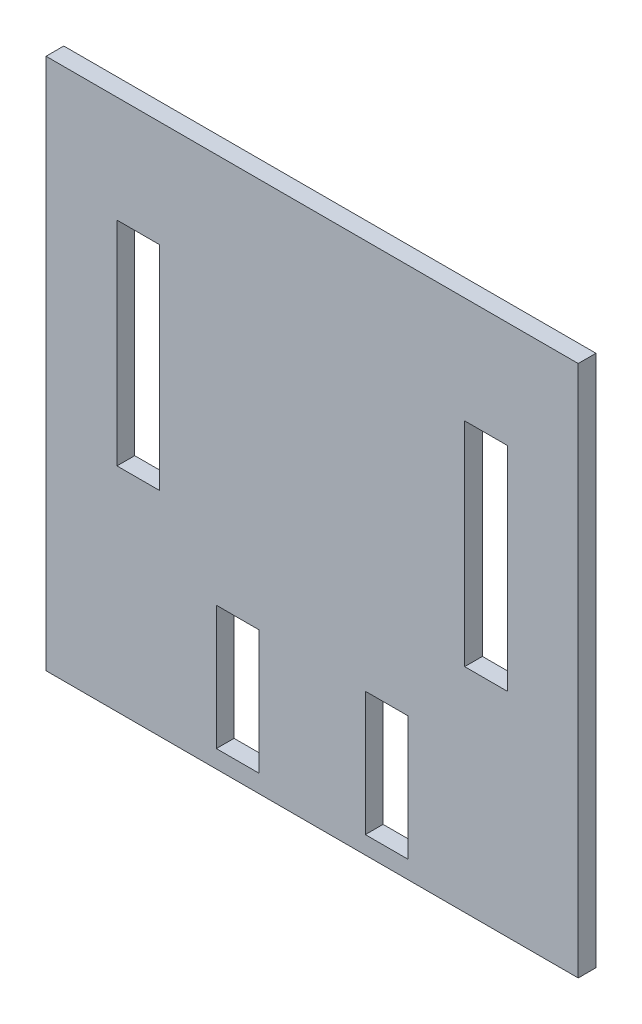
ISO-10303-21;
HEADER;
FILE_DESCRIPTION(('STEP AP214'),'2;1');
FILE_NAME('part.step','',(''),(''),'','','');
FILE_SCHEMA(('AUTOMOTIVE_DESIGN { 1 0 10303 214 1 1 1 1 }'));
ENDSEC;
DATA;
#1=APPLICATION_CONTEXT('core data for automotive mechanical design processes');
#2=APPLICATION_PROTOCOL_DEFINITION('international standard','automotive_design',2000,#1);
#3=PRODUCT_CONTEXT('',#1,'mechanical');
#4=PRODUCT('Part','Part','',(#3));
#5=PRODUCT_RELATED_PRODUCT_CATEGORY('part','',(#4));
#6=PRODUCT_DEFINITION_FORMATION('','',#4);
#7=PRODUCT_DEFINITION_CONTEXT('part definition',#1,'design');
#8=PRODUCT_DEFINITION('design','',#6,#7);
#9=PRODUCT_DEFINITION_SHAPE('','',#8);
#10=(LENGTH_UNIT() NAMED_UNIT(*) SI_UNIT(.MILLI.,.METRE.));
#11=(NAMED_UNIT(*) PLANE_ANGLE_UNIT() SI_UNIT($,.RADIAN.));
#12=(NAMED_UNIT(*) SI_UNIT($,.STERADIAN.) SOLID_ANGLE_UNIT());
#13=UNCERTAINTY_MEASURE_WITH_UNIT(LENGTH_MEASURE(1.E-05),#10,'distance_accuracy_value','');
#14=(GEOMETRIC_REPRESENTATION_CONTEXT(3) GLOBAL_UNCERTAINTY_ASSIGNED_CONTEXT((#13)) GLOBAL_UNIT_ASSIGNED_CONTEXT((#10,
#11,#12)) REPRESENTATION_CONTEXT('',''));
#15=CARTESIAN_POINT('',(0.,0.,0.));
#16=DIRECTION('',(0.,0.,1.));
#17=DIRECTION('',(1.,0.,0.));
#18=AXIS2_PLACEMENT_3D('',#15,#16,#17);
#19=CARTESIAN_POINT('',(0.,0.,5.));
#20=DIRECTION('',(1.,0.,0.));
#21=DIRECTION('',(0.,0.,-1.));
#22=AXIS2_PLACEMENT_3D('',#19,#20,#21);
#23=PLANE('',#22);
#24=DIRECTION('',(0.,-1.,0.));
#25=VECTOR('',#24,1.);
#26=CARTESIAN_POINT('',(0.,0.,0.));
#27=LINE('',#26,#25);
#28=CARTESIAN_POINT('',(0.,150.,0.));
#29=VERTEX_POINT('',#28);
#30=CARTESIAN_POINT('',(0.,0.,0.));
#31=VERTEX_POINT('',#30);
#32=EDGE_CURVE('E206',#29,#31,#27,.T.);
#33=ORIENTED_EDGE('',*,*,#32,.T.);
#34=DIRECTION('',(0.,0.,-1.));
#35=VECTOR('',#34,1.);
#36=CARTESIAN_POINT('',(0.,0.,5.));
#37=LINE('',#36,#35);
#38=CARTESIAN_POINT('',(0.,0.,5.));
#39=VERTEX_POINT('',#38);
#40=EDGE_CURVE('E11',#39,#31,#37,.T.);
#41=ORIENTED_EDGE('',*,*,#40,.F.);
#42=DIRECTION('',(0.,-1.,0.));
#43=VECTOR('',#42,1.);
#44=CARTESIAN_POINT('',(0.,0.,5.));
#45=LINE('',#44,#43);
#46=CARTESIAN_POINT('',(0.,150.,5.));
#47=VERTEX_POINT('',#46);
#48=EDGE_CURVE('E303',#47,#39,#45,.T.);
#49=ORIENTED_EDGE('',*,*,#48,.F.);
#50=DIRECTION('',(0.,0.,-1.));
#51=VECTOR('',#50,1.);
#52=CARTESIAN_POINT('',(0.,150.,5.));
#53=LINE('',#52,#51);
#54=EDGE_CURVE('E313',#47,#29,#53,.T.);
#55=ORIENTED_EDGE('',*,*,#54,.T.);
#56=EDGE_LOOP('',(#33,#41,#49,#55));
#57=FACE_BOUND('',#56,.T.);
#58=ADVANCED_FACE('F33',(#57),#23,.F.);
#59=CARTESIAN_POINT('',(0.,0.,5.));
#60=DIRECTION('',(0.,1.,0.));
#61=DIRECTION('',(0.,0.,1.));
#62=AXIS2_PLACEMENT_3D('',#59,#60,#61);
#63=PLANE('',#62);
#64=DIRECTION('',(1.,0.,0.));
#65=VECTOR('',#64,1.);
#66=CARTESIAN_POINT('',(0.,0.,0.));
#67=LINE('',#66,#65);
#68=CARTESIAN_POINT('',(150.,0.,0.));
#69=VERTEX_POINT('',#68);
#70=EDGE_CURVE('E316',#31,#69,#67,.T.);
#71=ORIENTED_EDGE('',*,*,#70,.T.);
#72=DIRECTION('',(0.,0.,-1.));
#73=VECTOR('',#72,1.);
#74=CARTESIAN_POINT('',(150.,0.,5.));
#75=LINE('',#74,#73);
#76=CARTESIAN_POINT('',(150.,0.,5.));
#77=VERTEX_POINT('',#76);
#78=EDGE_CURVE('E40',#77,#69,#75,.T.);
#79=ORIENTED_EDGE('',*,*,#78,.F.);
#80=DIRECTION('',(1.,0.,0.));
#81=VECTOR('',#80,1.);
#82=CARTESIAN_POINT('',(0.,0.,5.));
#83=LINE('',#82,#81);
#84=EDGE_CURVE('E306',#39,#77,#83,.T.);
#85=ORIENTED_EDGE('',*,*,#84,.F.);
#86=ORIENTED_EDGE('',*,*,#40,.T.);
#87=EDGE_LOOP('',(#71,#79,#85,#86));
#88=FACE_BOUND('',#87,.T.);
#89=ADVANCED_FACE('F345',(#88),#63,.F.);
#90=CARTESIAN_POINT('',(150.,0.,5.));
#91=DIRECTION('',(-1.,0.,0.));
#92=DIRECTION('',(0.,0.,1.));
#93=AXIS2_PLACEMENT_3D('',#90,#91,#92);
#94=PLANE('',#93);
#95=DIRECTION('',(0.,1.,0.));
#96=VECTOR('',#95,1.);
#97=CARTESIAN_POINT('',(150.,0.,0.));
#98=LINE('',#97,#96);
#99=CARTESIAN_POINT('',(150.,150.,0.));
#100=VERTEX_POINT('',#99);
#101=EDGE_CURVE('E318',#69,#100,#98,.T.);
#102=ORIENTED_EDGE('',*,*,#101,.T.);
#103=DIRECTION('',(0.,0.,-1.));
#104=VECTOR('',#103,1.);
#105=CARTESIAN_POINT('',(150.,150.,5.));
#106=LINE('',#105,#104);
#107=CARTESIAN_POINT('',(150.,150.,5.));
#108=VERTEX_POINT('',#107);
#109=EDGE_CURVE('E323',#108,#100,#106,.T.);
#110=ORIENTED_EDGE('',*,*,#109,.F.);
#111=DIRECTION('',(0.,1.,0.));
#112=VECTOR('',#111,1.);
#113=CARTESIAN_POINT('',(150.,0.,5.));
#114=LINE('',#113,#112);
#115=EDGE_CURVE('E309',#77,#108,#114,.T.);
#116=ORIENTED_EDGE('',*,*,#115,.F.);
#117=ORIENTED_EDGE('',*,*,#78,.T.);
#118=EDGE_LOOP('',(#102,#110,#116,#117));
#119=FACE_BOUND('',#118,.T.);
#120=ADVANCED_FACE('F330',(#119),#94,.F.);
#121=CARTESIAN_POINT('',(0.,150.,5.));
#122=DIRECTION('',(0.,-1.,0.));
#123=DIRECTION('',(0.,0.,-1.));
#124=AXIS2_PLACEMENT_3D('',#121,#122,#123);
#125=PLANE('',#124);
#126=DIRECTION('',(-1.,0.,0.));
#127=VECTOR('',#126,1.);
#128=CARTESIAN_POINT('',(0.,150.,0.));
#129=LINE('',#128,#127);
#130=EDGE_CURVE('E307',#100,#29,#129,.T.);
#131=ORIENTED_EDGE('',*,*,#130,.T.);
#132=ORIENTED_EDGE('',*,*,#54,.F.);
#133=DIRECTION('',(-1.,0.,0.));
#134=VECTOR('',#133,1.);
#135=CARTESIAN_POINT('',(0.,150.,5.));
#136=LINE('',#135,#134);
#137=EDGE_CURVE('E311',#108,#47,#136,.T.);
#138=ORIENTED_EDGE('',*,*,#137,.F.);
#139=ORIENTED_EDGE('',*,*,#109,.T.);
#140=EDGE_LOOP('',(#131,#132,#138,#139));
#141=FACE_BOUND('',#140,.T.);
#142=ADVANCED_FACE('F338',(#141),#125,.F.);
#143=CARTESIAN_POINT('',(0.,0.,5.));
#144=DIRECTION('',(0.,0.,-1.));
#145=DIRECTION('',(-1.,0.,0.));
#146=AXIS2_PLACEMENT_3D('',#143,#144,#145);
#147=PLANE('',#146);
#148=DIRECTION('',(1.,0.,0.));
#149=VECTOR('',#148,1.);
#150=CARTESIAN_POINT('',(20.,60.,5.));
#151=LINE('',#150,#149);
#152=CARTESIAN_POINT('',(20.,60.,5.));
#153=VERTEX_POINT('',#152);
#154=CARTESIAN_POINT('',(32.,60.,5.));
#155=VERTEX_POINT('',#154);
#156=EDGE_CURVE('E199',#153,#155,#151,.T.);
#157=ORIENTED_EDGE('',*,*,#156,.F.);
#158=DIRECTION('',(0.,-1.,0.));
#159=VECTOR('',#158,1.);
#160=CARTESIAN_POINT('',(20.,120.,5.));
#161=LINE('',#160,#159);
#162=CARTESIAN_POINT('',(20.,120.,5.));
#163=VERTEX_POINT('',#162);
#164=EDGE_CURVE('E47',#163,#153,#161,.T.);
#165=ORIENTED_EDGE('',*,*,#164,.F.);
#166=DIRECTION('',(-1.,0.,0.));
#167=VECTOR('',#166,1.);
#168=CARTESIAN_POINT('',(20.,120.,5.));
#169=LINE('',#168,#167);
#170=CARTESIAN_POINT('',(32.,120.,5.));
#171=VERTEX_POINT('',#170);
#172=EDGE_CURVE('E190',#171,#163,#169,.T.);
#173=ORIENTED_EDGE('',*,*,#172,.F.);
#174=DIRECTION('',(0.,1.,0.));
#175=VECTOR('',#174,1.);
#176=CARTESIAN_POINT('',(32.,120.,5.));
#177=LINE('',#176,#175);
#178=EDGE_CURVE('E193',#155,#171,#177,.T.);
#179=ORIENTED_EDGE('',*,*,#178,.F.);
#180=EDGE_LOOP('',(#157,#165,#173,#179));
#181=FACE_BOUND('',#180,.T.);
#182=DIRECTION('',(1.,0.,0.));
#183=VECTOR('',#182,1.);
#184=CARTESIAN_POINT('',(90.,5.,5.));
#185=LINE('',#184,#183);
#186=CARTESIAN_POINT('',(90.,5.,5.));
#187=VERTEX_POINT('',#186);
#188=CARTESIAN_POINT('',(102.,5.,5.));
#189=VERTEX_POINT('',#188);
#190=EDGE_CURVE('E225',#187,#189,#185,.T.);
#191=ORIENTED_EDGE('',*,*,#190,.F.);
#192=DIRECTION('',(0.,-1.,0.));
#193=VECTOR('',#192,1.);
#194=CARTESIAN_POINT('',(90.,40.,5.));
#195=LINE('',#194,#193);
#196=CARTESIAN_POINT('',(90.,40.,5.));
#197=VERTEX_POINT('',#196);
#198=EDGE_CURVE('E55',#197,#187,#195,.T.);
#199=ORIENTED_EDGE('',*,*,#198,.F.);
#200=DIRECTION('',(-1.,0.,0.));
#201=VECTOR('',#200,1.);
#202=CARTESIAN_POINT('',(90.,40.,5.));
#203=LINE('',#202,#201);
#204=CARTESIAN_POINT('',(102.,40.,5.));
#205=VERTEX_POINT('',#204);
#206=EDGE_CURVE('E214',#205,#197,#203,.T.);
#207=ORIENTED_EDGE('',*,*,#206,.F.);
#208=DIRECTION('',(0.,1.,0.));
#209=VECTOR('',#208,1.);
#210=CARTESIAN_POINT('',(102.,40.,5.));
#211=LINE('',#210,#209);
#212=EDGE_CURVE('E228',#189,#205,#211,.T.);
#213=ORIENTED_EDGE('',*,*,#212,.F.);
#214=EDGE_LOOP('',(#191,#199,#207,#213));
#215=FACE_BOUND('',#214,.T.);
#216=DIRECTION('',(1.,0.,0.));
#217=VECTOR('',#216,1.);
#218=CARTESIAN_POINT('',(48.,5.,5.));
#219=LINE('',#218,#217);
#220=CARTESIAN_POINT('',(48.,5.,5.));
#221=VERTEX_POINT('',#220);
#222=CARTESIAN_POINT('',(60.,5.,5.));
#223=VERTEX_POINT('',#222);
#224=EDGE_CURVE('E288',#221,#223,#219,.T.);
#225=ORIENTED_EDGE('',*,*,#224,.F.);
#226=DIRECTION('',(0.,-1.,0.));
#227=VECTOR('',#226,1.);
#228=CARTESIAN_POINT('',(48.,40.,5.));
#229=LINE('',#228,#227);
#230=CARTESIAN_POINT('',(48.,40.,5.));
#231=VERTEX_POINT('',#230);
#232=EDGE_CURVE('E235',#231,#221,#229,.T.);
#233=ORIENTED_EDGE('',*,*,#232,.F.);
#234=DIRECTION('',(-1.,0.,0.));
#235=VECTOR('',#234,1.);
#236=CARTESIAN_POINT('',(48.,40.,5.));
#237=LINE('',#236,#235);
#238=CARTESIAN_POINT('',(60.,40.,5.));
#239=VERTEX_POINT('',#238);
#240=EDGE_CURVE('E277',#239,#231,#237,.T.);
#241=ORIENTED_EDGE('',*,*,#240,.F.);
#242=DIRECTION('',(0.,1.,0.));
#243=VECTOR('',#242,1.);
#244=CARTESIAN_POINT('',(60.,40.,5.));
#245=LINE('',#244,#243);
#246=EDGE_CURVE('E291',#223,#239,#245,.T.);
#247=ORIENTED_EDGE('',*,*,#246,.F.);
#248=EDGE_LOOP('',(#225,#233,#241,#247));
#249=FACE_BOUND('',#248,.T.);
#250=DIRECTION('',(1.,0.,0.));
#251=VECTOR('',#250,1.);
#252=CARTESIAN_POINT('',(118.,60.,5.));
#253=LINE('',#252,#251);
#254=CARTESIAN_POINT('',(118.,60.,5.));
#255=VERTEX_POINT('',#254);
#256=CARTESIAN_POINT('',(130.,60.,5.));
#257=VERTEX_POINT('',#256);
#258=EDGE_CURVE('E257',#255,#257,#253,.T.);
#259=ORIENTED_EDGE('',*,*,#258,.F.);
#260=DIRECTION('',(0.,-1.,0.));
#261=VECTOR('',#260,1.);
#262=CARTESIAN_POINT('',(118.,120.,5.));
#263=LINE('',#262,#261);
#264=CARTESIAN_POINT('',(118.,120.,5.));
#265=VERTEX_POINT('',#264);
#266=EDGE_CURVE('E255',#265,#255,#263,.T.);
#267=ORIENTED_EDGE('',*,*,#266,.F.);
#268=DIRECTION('',(-1.,0.,0.));
#269=VECTOR('',#268,1.);
#270=CARTESIAN_POINT('',(118.,120.,5.));
#271=LINE('',#270,#269);
#272=CARTESIAN_POINT('',(130.,120.,5.));
#273=VERTEX_POINT('',#272);
#274=EDGE_CURVE('E245',#273,#265,#271,.T.);
#275=ORIENTED_EDGE('',*,*,#274,.F.);
#276=DIRECTION('',(0.,1.,0.));
#277=VECTOR('',#276,1.);
#278=CARTESIAN_POINT('',(130.,120.,5.));
#279=LINE('',#278,#277);
#280=EDGE_CURVE('E261',#257,#273,#279,.T.);
#281=ORIENTED_EDGE('',*,*,#280,.F.);
#282=EDGE_LOOP('',(#259,#267,#275,#281));
#283=FACE_BOUND('',#282,.T.);
#284=ORIENTED_EDGE('',*,*,#48,.T.);
#285=ORIENTED_EDGE('',*,*,#84,.T.);
#286=ORIENTED_EDGE('',*,*,#115,.T.);
#287=ORIENTED_EDGE('',*,*,#137,.T.);
#288=EDGE_LOOP('',(#284,#285,#286,#287));
#289=FACE_BOUND('',#288,.T.);
#290=ADVANCED_FACE('F344',(#181,#215,#249,#283,#289),#147,.F.);
#291=CARTESIAN_POINT('',(0.,0.,0.));
#292=DIRECTION('',(0.,0.,-1.));
#293=DIRECTION('',(-1.,0.,0.));
#294=AXIS2_PLACEMENT_3D('',#291,#292,#293);
#295=PLANE('',#294);
#296=DIRECTION('',(0.,-1.,0.));
#297=VECTOR('',#296,1.);
#298=CARTESIAN_POINT('',(20.,120.,0.));
#299=LINE('',#298,#297);
#300=CARTESIAN_POINT('',(20.,120.,0.));
#301=VERTEX_POINT('',#300);
#302=CARTESIAN_POINT('',(20.,60.,0.));
#303=VERTEX_POINT('',#302);
#304=EDGE_CURVE('E171',#301,#303,#299,.T.);
#305=ORIENTED_EDGE('',*,*,#304,.T.);
#306=DIRECTION('',(1.,0.,0.));
#307=VECTOR('',#306,1.);
#308=CARTESIAN_POINT('',(20.,60.,0.));
#309=LINE('',#308,#307);
#310=CARTESIAN_POINT('',(32.,60.,0.));
#311=VERTEX_POINT('',#310);
#312=EDGE_CURVE('E181',#303,#311,#309,.T.);
#313=ORIENTED_EDGE('',*,*,#312,.T.);
#314=DIRECTION('',(0.,1.,0.));
#315=VECTOR('',#314,1.);
#316=CARTESIAN_POINT('',(32.,120.,0.));
#317=LINE('',#316,#315);
#318=CARTESIAN_POINT('',(32.,120.,0.));
#319=VERTEX_POINT('',#318);
#320=EDGE_CURVE('E185',#311,#319,#317,.T.);
#321=ORIENTED_EDGE('',*,*,#320,.T.);
#322=DIRECTION('',(-1.,0.,0.));
#323=VECTOR('',#322,1.);
#324=CARTESIAN_POINT('',(20.,120.,0.));
#325=LINE('',#324,#323);
#326=EDGE_CURVE('E177',#319,#301,#325,.T.);
#327=ORIENTED_EDGE('',*,*,#326,.T.);
#328=EDGE_LOOP('',(#305,#313,#321,#327));
#329=FACE_BOUND('',#328,.T.);
#330=DIRECTION('',(0.,-1.,0.));
#331=VECTOR('',#330,1.);
#332=CARTESIAN_POINT('',(90.,40.,0.));
#333=LINE('',#332,#331);
#334=CARTESIAN_POINT('',(90.,40.,0.));
#335=VERTEX_POINT('',#334);
#336=CARTESIAN_POINT('',(90.,5.,0.));
#337=VERTEX_POINT('',#336);
#338=EDGE_CURVE('E210',#335,#337,#333,.T.);
#339=ORIENTED_EDGE('',*,*,#338,.T.);
#340=DIRECTION('',(1.,0.,0.));
#341=VECTOR('',#340,1.);
#342=CARTESIAN_POINT('',(90.,5.,0.));
#343=LINE('',#342,#341);
#344=CARTESIAN_POINT('',(102.,5.,0.));
#345=VERTEX_POINT('',#344);
#346=EDGE_CURVE('E213',#337,#345,#343,.T.);
#347=ORIENTED_EDGE('',*,*,#346,.T.);
#348=DIRECTION('',(0.,1.,0.));
#349=VECTOR('',#348,1.);
#350=CARTESIAN_POINT('',(102.,40.,0.));
#351=LINE('',#350,#349);
#352=CARTESIAN_POINT('',(102.,40.,0.));
#353=VERTEX_POINT('',#352);
#354=EDGE_CURVE('E217',#345,#353,#351,.T.);
#355=ORIENTED_EDGE('',*,*,#354,.T.);
#356=DIRECTION('',(-1.,0.,0.));
#357=VECTOR('',#356,1.);
#358=CARTESIAN_POINT('',(90.,40.,0.));
#359=LINE('',#358,#357);
#360=EDGE_CURVE('E220',#353,#335,#359,.T.);
#361=ORIENTED_EDGE('',*,*,#360,.T.);
#362=EDGE_LOOP('',(#339,#347,#355,#361));
#363=FACE_BOUND('',#362,.T.);
#364=DIRECTION('',(0.,-1.,0.));
#365=VECTOR('',#364,1.);
#366=CARTESIAN_POINT('',(48.,40.,0.));
#367=LINE('',#366,#365);
#368=CARTESIAN_POINT('',(48.,40.,0.));
#369=VERTEX_POINT('',#368);
#370=CARTESIAN_POINT('',(48.,5.,0.));
#371=VERTEX_POINT('',#370);
#372=EDGE_CURVE('E273',#369,#371,#367,.T.);
#373=ORIENTED_EDGE('',*,*,#372,.T.);
#374=DIRECTION('',(1.,0.,0.));
#375=VECTOR('',#374,1.);
#376=CARTESIAN_POINT('',(48.,5.,0.));
#377=LINE('',#376,#375);
#378=CARTESIAN_POINT('',(60.,5.,0.));
#379=VERTEX_POINT('',#378);
#380=EDGE_CURVE('E276',#371,#379,#377,.T.);
#381=ORIENTED_EDGE('',*,*,#380,.T.);
#382=DIRECTION('',(0.,1.,0.));
#383=VECTOR('',#382,1.);
#384=CARTESIAN_POINT('',(60.,40.,0.));
#385=LINE('',#384,#383);
#386=CARTESIAN_POINT('',(60.,40.,0.));
#387=VERTEX_POINT('',#386);
#388=EDGE_CURVE('E280',#379,#387,#385,.T.);
#389=ORIENTED_EDGE('',*,*,#388,.T.);
#390=DIRECTION('',(-1.,0.,0.));
#391=VECTOR('',#390,1.);
#392=CARTESIAN_POINT('',(48.,40.,0.));
#393=LINE('',#392,#391);
#394=EDGE_CURVE('E283',#387,#369,#393,.T.);
#395=ORIENTED_EDGE('',*,*,#394,.T.);
#396=EDGE_LOOP('',(#373,#381,#389,#395));
#397=FACE_BOUND('',#396,.T.);
#398=DIRECTION('',(0.,-1.,0.));
#399=VECTOR('',#398,1.);
#400=CARTESIAN_POINT('',(118.,120.,0.));
#401=LINE('',#400,#399);
#402=CARTESIAN_POINT('',(118.,120.,0.));
#403=VERTEX_POINT('',#402);
#404=CARTESIAN_POINT('',(118.,60.,0.));
#405=VERTEX_POINT('',#404);
#406=EDGE_CURVE('E241',#403,#405,#401,.T.);
#407=ORIENTED_EDGE('',*,*,#406,.T.);
#408=DIRECTION('',(1.,0.,0.));
#409=VECTOR('',#408,1.);
#410=CARTESIAN_POINT('',(118.,60.,0.));
#411=LINE('',#410,#409);
#412=CARTESIAN_POINT('',(130.,60.,0.));
#413=VERTEX_POINT('',#412);
#414=EDGE_CURVE('E244',#405,#413,#411,.T.);
#415=ORIENTED_EDGE('',*,*,#414,.T.);
#416=DIRECTION('',(0.,1.,0.));
#417=VECTOR('',#416,1.);
#418=CARTESIAN_POINT('',(130.,120.,0.));
#419=LINE('',#418,#417);
#420=CARTESIAN_POINT('',(130.,120.,0.));
#421=VERTEX_POINT('',#420);
#422=EDGE_CURVE('E248',#413,#421,#419,.T.);
#423=ORIENTED_EDGE('',*,*,#422,.T.);
#424=DIRECTION('',(-1.,0.,0.));
#425=VECTOR('',#424,1.);
#426=CARTESIAN_POINT('',(118.,120.,0.));
#427=LINE('',#426,#425);
#428=EDGE_CURVE('E251',#421,#403,#427,.T.);
#429=ORIENTED_EDGE('',*,*,#428,.T.);
#430=EDGE_LOOP('',(#407,#415,#423,#429));
#431=FACE_BOUND('',#430,.T.);
#432=ORIENTED_EDGE('',*,*,#32,.F.);
#433=ORIENTED_EDGE('',*,*,#130,.F.);
#434=ORIENTED_EDGE('',*,*,#101,.F.);
#435=ORIENTED_EDGE('',*,*,#70,.F.);
#436=EDGE_LOOP('',(#432,#433,#434,#435));
#437=FACE_BOUND('',#436,.T.);
#438=ADVANCED_FACE('F187',(#329,#363,#397,#431,#437),#295,.T.);
#439=CARTESIAN_POINT('',(118.,120.,0.));
#440=DIRECTION('',(-1.,0.,0.));
#441=DIRECTION('',(0.,-1.,0.));
#442=AXIS2_PLACEMENT_3D('',#439,#440,#441);
#443=PLANE('',#442);
#444=ORIENTED_EDGE('',*,*,#266,.T.);
#445=DIRECTION('',(0.,0.,1.));
#446=VECTOR('',#445,1.);
#447=CARTESIAN_POINT('',(118.,60.,0.));
#448=LINE('',#447,#446);
#449=EDGE_CURVE('E254',#405,#255,#448,.T.);
#450=ORIENTED_EDGE('',*,*,#449,.F.);
#451=ORIENTED_EDGE('',*,*,#406,.F.);
#452=DIRECTION('',(0.,0.,1.));
#453=VECTOR('',#452,1.);
#454=CARTESIAN_POINT('',(118.,120.,0.));
#455=LINE('',#454,#453);
#456=EDGE_CURVE('E200',#403,#265,#455,.T.);
#457=ORIENTED_EDGE('',*,*,#456,.T.);
#458=EDGE_LOOP('',(#444,#450,#451,#457));
#459=FACE_BOUND('',#458,.T.);
#460=ADVANCED_FACE('F357',(#459),#443,.F.);
#461=CARTESIAN_POINT('',(118.,120.,0.));
#462=DIRECTION('',(0.,1.,0.));
#463=DIRECTION('',(-1.,0.,0.));
#464=AXIS2_PLACEMENT_3D('',#461,#462,#463);
#465=PLANE('',#464);
#466=ORIENTED_EDGE('',*,*,#274,.T.);
#467=ORIENTED_EDGE('',*,*,#456,.F.);
#468=ORIENTED_EDGE('',*,*,#428,.F.);
#469=DIRECTION('',(0.,0.,1.));
#470=VECTOR('',#469,1.);
#471=CARTESIAN_POINT('',(130.,120.,0.));
#472=LINE('',#471,#470);
#473=EDGE_CURVE('E267',#421,#273,#472,.T.);
#474=ORIENTED_EDGE('',*,*,#473,.T.);
#475=EDGE_LOOP('',(#466,#467,#468,#474));
#476=FACE_BOUND('',#475,.T.);
#477=ADVANCED_FACE('F381',(#476),#465,.F.);
#478=CARTESIAN_POINT('',(130.,120.,0.));
#479=DIRECTION('',(1.,0.,0.));
#480=DIRECTION('',(0.,1.,0.));
#481=AXIS2_PLACEMENT_3D('',#478,#479,#480);
#482=PLANE('',#481);
#483=ORIENTED_EDGE('',*,*,#280,.T.);
#484=ORIENTED_EDGE('',*,*,#473,.F.);
#485=ORIENTED_EDGE('',*,*,#422,.F.);
#486=DIRECTION('',(0.,0.,1.));
#487=VECTOR('',#486,1.);
#488=CARTESIAN_POINT('',(130.,60.,0.));
#489=LINE('',#488,#487);
#490=EDGE_CURVE('E269',#413,#257,#489,.T.);
#491=ORIENTED_EDGE('',*,*,#490,.T.);
#492=EDGE_LOOP('',(#483,#484,#485,#491));
#493=FACE_BOUND('',#492,.T.);
#494=ADVANCED_FACE('F385',(#493),#482,.F.);
#495=CARTESIAN_POINT('',(118.,60.,0.));
#496=DIRECTION('',(0.,-1.,0.));
#497=DIRECTION('',(0.,0.,-1.));
#498=AXIS2_PLACEMENT_3D('',#495,#496,#497);
#499=PLANE('',#498);
#500=ORIENTED_EDGE('',*,*,#258,.T.);
#501=ORIENTED_EDGE('',*,*,#490,.F.);
#502=ORIENTED_EDGE('',*,*,#414,.F.);
#503=ORIENTED_EDGE('',*,*,#449,.T.);
#504=EDGE_LOOP('',(#500,#501,#502,#503));
#505=FACE_BOUND('',#504,.T.);
#506=ADVANCED_FACE('F365',(#505),#499,.F.);
#507=CARTESIAN_POINT('',(48.,40.,0.));
#508=DIRECTION('',(-1.,0.,0.));
#509=DIRECTION('',(0.,-1.,0.));
#510=AXIS2_PLACEMENT_3D('',#507,#508,#509);
#511=PLANE('',#510);
#512=ORIENTED_EDGE('',*,*,#232,.T.);
#513=DIRECTION('',(0.,0.,1.));
#514=VECTOR('',#513,1.);
#515=CARTESIAN_POINT('',(48.,5.,0.));
#516=LINE('',#515,#514);
#517=EDGE_CURVE('E286',#371,#221,#516,.T.);
#518=ORIENTED_EDGE('',*,*,#517,.F.);
#519=ORIENTED_EDGE('',*,*,#372,.F.);
#520=DIRECTION('',(0.,0.,1.));
#521=VECTOR('',#520,1.);
#522=CARTESIAN_POINT('',(48.,40.,0.));
#523=LINE('',#522,#521);
#524=EDGE_CURVE('E258',#369,#231,#523,.T.);
#525=ORIENTED_EDGE('',*,*,#524,.T.);
#526=EDGE_LOOP('',(#512,#518,#519,#525));
#527=FACE_BOUND('',#526,.T.);
#528=ADVANCED_FACE('F361',(#527),#511,.F.);
#529=CARTESIAN_POINT('',(48.,40.,0.));
#530=DIRECTION('',(0.,1.,0.));
#531=DIRECTION('',(0.,0.,1.));
#532=AXIS2_PLACEMENT_3D('',#529,#530,#531);
#533=PLANE('',#532);
#534=ORIENTED_EDGE('',*,*,#240,.T.);
#535=ORIENTED_EDGE('',*,*,#524,.F.);
#536=ORIENTED_EDGE('',*,*,#394,.F.);
#537=DIRECTION('',(0.,0.,1.));
#538=VECTOR('',#537,1.);
#539=CARTESIAN_POINT('',(60.,40.,0.));
#540=LINE('',#539,#538);
#541=EDGE_CURVE('E297',#387,#239,#540,.T.);
#542=ORIENTED_EDGE('',*,*,#541,.T.);
#543=EDGE_LOOP('',(#534,#535,#536,#542));
#544=FACE_BOUND('',#543,.T.);
#545=ADVANCED_FACE('F364',(#544),#533,.F.);
#546=CARTESIAN_POINT('',(60.,40.,0.));
#547=DIRECTION('',(1.,0.,0.));
#548=DIRECTION('',(0.,1.,0.));
#549=AXIS2_PLACEMENT_3D('',#546,#547,#548);
#550=PLANE('',#549);
#551=ORIENTED_EDGE('',*,*,#246,.T.);
#552=ORIENTED_EDGE('',*,*,#541,.F.);
#553=ORIENTED_EDGE('',*,*,#388,.F.);
#554=DIRECTION('',(0.,0.,1.));
#555=VECTOR('',#554,1.);
#556=CARTESIAN_POINT('',(60.,5.,0.));
#557=LINE('',#556,#555);
#558=EDGE_CURVE('E299',#379,#223,#557,.T.);
#559=ORIENTED_EDGE('',*,*,#558,.T.);
#560=EDGE_LOOP('',(#551,#552,#553,#559));
#561=FACE_BOUND('',#560,.T.);
#562=ADVANCED_FACE('F371',(#561),#550,.F.);
#563=CARTESIAN_POINT('',(48.,5.,0.));
#564=DIRECTION('',(0.,-1.,0.));
#565=DIRECTION('',(0.,0.,-1.));
#566=AXIS2_PLACEMENT_3D('',#563,#564,#565);
#567=PLANE('',#566);
#568=ORIENTED_EDGE('',*,*,#224,.T.);
#569=ORIENTED_EDGE('',*,*,#558,.F.);
#570=ORIENTED_EDGE('',*,*,#380,.F.);
#571=ORIENTED_EDGE('',*,*,#517,.T.);
#572=EDGE_LOOP('',(#568,#569,#570,#571));
#573=FACE_BOUND('',#572,.T.);
#574=ADVANCED_FACE('F367',(#573),#567,.F.);
#575=CARTESIAN_POINT('',(90.,40.,0.));
#576=DIRECTION('',(-1.,0.,0.));
#577=DIRECTION('',(0.,0.,1.));
#578=AXIS2_PLACEMENT_3D('',#575,#576,#577);
#579=PLANE('',#578);
#580=ORIENTED_EDGE('',*,*,#198,.T.);
#581=DIRECTION('',(0.,0.,1.));
#582=VECTOR('',#581,1.);
#583=CARTESIAN_POINT('',(90.,5.,0.));
#584=LINE('',#583,#582);
#585=EDGE_CURVE('E223',#337,#187,#584,.T.);
#586=ORIENTED_EDGE('',*,*,#585,.F.);
#587=ORIENTED_EDGE('',*,*,#338,.F.);
#588=DIRECTION('',(0.,0.,1.));
#589=VECTOR('',#588,1.);
#590=CARTESIAN_POINT('',(90.,40.,0.));
#591=LINE('',#590,#589);
#592=EDGE_CURVE('E233',#335,#197,#591,.T.);
#593=ORIENTED_EDGE('',*,*,#592,.T.);
#594=EDGE_LOOP('',(#580,#586,#587,#593));
#595=FACE_BOUND('',#594,.T.);
#596=ADVANCED_FACE('F370',(#595),#579,.F.);
#597=CARTESIAN_POINT('',(90.,40.,0.));
#598=DIRECTION('',(0.,1.,0.));
#599=DIRECTION('',(0.,0.,1.));
#600=AXIS2_PLACEMENT_3D('',#597,#598,#599);
#601=PLANE('',#600);
#602=ORIENTED_EDGE('',*,*,#206,.T.);
#603=ORIENTED_EDGE('',*,*,#592,.F.);
#604=ORIENTED_EDGE('',*,*,#360,.F.);
#605=DIRECTION('',(0.,0.,1.));
#606=VECTOR('',#605,1.);
#607=CARTESIAN_POINT('',(102.,40.,0.));
#608=LINE('',#607,#606);
#609=EDGE_CURVE('E236',#353,#205,#608,.T.);
#610=ORIENTED_EDGE('',*,*,#609,.T.);
#611=EDGE_LOOP('',(#602,#603,#604,#610));
#612=FACE_BOUND('',#611,.T.);
#613=ADVANCED_FACE('F395',(#612),#601,.F.);
#614=CARTESIAN_POINT('',(102.,40.,0.));
#615=DIRECTION('',(1.,0.,0.));
#616=DIRECTION('',(0.,0.,-1.));
#617=AXIS2_PLACEMENT_3D('',#614,#615,#616);
#618=PLANE('',#617);
#619=ORIENTED_EDGE('',*,*,#212,.T.);
#620=ORIENTED_EDGE('',*,*,#609,.F.);
#621=ORIENTED_EDGE('',*,*,#354,.F.);
#622=DIRECTION('',(0.,0.,1.));
#623=VECTOR('',#622,1.);
#624=CARTESIAN_POINT('',(102.,5.,0.));
#625=LINE('',#624,#623);
#626=EDGE_CURVE('E238',#345,#189,#625,.T.);
#627=ORIENTED_EDGE('',*,*,#626,.T.);
#628=EDGE_LOOP('',(#619,#620,#621,#627));
#629=FACE_BOUND('',#628,.T.);
#630=ADVANCED_FACE('F399',(#629),#618,.F.);
#631=CARTESIAN_POINT('',(90.,5.,0.));
#632=DIRECTION('',(0.,-1.,0.));
#633=DIRECTION('',(0.,0.,-1.));
#634=AXIS2_PLACEMENT_3D('',#631,#632,#633);
#635=PLANE('',#634);
#636=ORIENTED_EDGE('',*,*,#190,.T.);
#637=ORIENTED_EDGE('',*,*,#626,.F.);
#638=ORIENTED_EDGE('',*,*,#346,.F.);
#639=ORIENTED_EDGE('',*,*,#585,.T.);
#640=EDGE_LOOP('',(#636,#637,#638,#639));
#641=FACE_BOUND('',#640,.T.);
#642=ADVANCED_FACE('F396',(#641),#635,.F.);
#643=CARTESIAN_POINT('',(20.,120.,0.));
#644=DIRECTION('',(-1.,0.,0.));
#645=DIRECTION('',(0.,-1.,0.));
#646=AXIS2_PLACEMENT_3D('',#643,#644,#645);
#647=PLANE('',#646);
#648=ORIENTED_EDGE('',*,*,#164,.T.);
#649=DIRECTION('',(0.,0.,1.));
#650=VECTOR('',#649,1.);
#651=CARTESIAN_POINT('',(20.,60.,0.));
#652=LINE('',#651,#650);
#653=EDGE_CURVE('E167',#303,#153,#652,.T.);
#654=ORIENTED_EDGE('',*,*,#653,.F.);
#655=ORIENTED_EDGE('',*,*,#304,.F.);
#656=DIRECTION('',(0.,0.,1.));
#657=VECTOR('',#656,1.);
#658=CARTESIAN_POINT('',(20.,120.,0.));
#659=LINE('',#658,#657);
#660=EDGE_CURVE('E204',#301,#163,#659,.T.);
#661=ORIENTED_EDGE('',*,*,#660,.T.);
#662=EDGE_LOOP('',(#648,#654,#655,#661));
#663=FACE_BOUND('',#662,.T.);
#664=ADVANCED_FACE('F169',(#663),#647,.F.);
#665=CARTESIAN_POINT('',(20.,120.,0.));
#666=DIRECTION('',(0.,1.,0.));
#667=DIRECTION('',(0.,0.,1.));
#668=AXIS2_PLACEMENT_3D('',#665,#666,#667);
#669=PLANE('',#668);
#670=ORIENTED_EDGE('',*,*,#172,.T.);
#671=ORIENTED_EDGE('',*,*,#660,.F.);
#672=ORIENTED_EDGE('',*,*,#326,.F.);
#673=DIRECTION('',(0.,0.,1.));
#674=VECTOR('',#673,1.);
#675=CARTESIAN_POINT('',(32.,120.,0.));
#676=LINE('',#675,#674);
#677=EDGE_CURVE('E207',#319,#171,#676,.T.);
#678=ORIENTED_EDGE('',*,*,#677,.T.);
#679=EDGE_LOOP('',(#670,#671,#672,#678));
#680=FACE_BOUND('',#679,.T.);
#681=ADVANCED_FACE('F409',(#680),#669,.F.);
#682=CARTESIAN_POINT('',(32.,120.,0.));
#683=DIRECTION('',(1.,0.,0.));
#684=DIRECTION('',(0.,0.,-1.));
#685=AXIS2_PLACEMENT_3D('',#682,#683,#684);
#686=PLANE('',#685);
#687=ORIENTED_EDGE('',*,*,#178,.T.);
#688=ORIENTED_EDGE('',*,*,#677,.F.);
#689=ORIENTED_EDGE('',*,*,#320,.F.);
#690=DIRECTION('',(0.,0.,1.));
#691=VECTOR('',#690,1.);
#692=CARTESIAN_POINT('',(32.,60.,0.));
#693=LINE('',#692,#691);
#694=EDGE_CURVE('E176',#311,#155,#693,.T.);
#695=ORIENTED_EDGE('',*,*,#694,.T.);
#696=EDGE_LOOP('',(#687,#688,#689,#695));
#697=FACE_BOUND('',#696,.T.);
#698=ADVANCED_FACE('F412',(#697),#686,.F.);
#699=CARTESIAN_POINT('',(20.,60.,0.));
#700=DIRECTION('',(0.,-1.,0.));
#701=DIRECTION('',(0.,0.,-1.));
#702=AXIS2_PLACEMENT_3D('',#699,#700,#701);
#703=PLANE('',#702);
#704=ORIENTED_EDGE('',*,*,#156,.T.);
#705=ORIENTED_EDGE('',*,*,#694,.F.);
#706=ORIENTED_EDGE('',*,*,#312,.F.);
#707=ORIENTED_EDGE('',*,*,#653,.T.);
#708=EDGE_LOOP('',(#704,#705,#706,#707));
#709=FACE_BOUND('',#708,.T.);
#710=ADVANCED_FACE('F182',(#709),#703,.F.);
#711=CLOSED_SHELL('',(#58,#89,#120,#142,#290,#438,#460,#477,#494,#506,#528,#545,#562,#574,#596,
#613,#630,#642,#664,#681,#698,#710));
#712=MANIFOLD_SOLID_BREP('B2',#711);
#713=ADVANCED_BREP_SHAPE_REPRESENTATION('',(#18,#712),#14);
#714=SHAPE_DEFINITION_REPRESENTATION(#9,#713);
ENDSEC;
END-ISO-10303-21;
